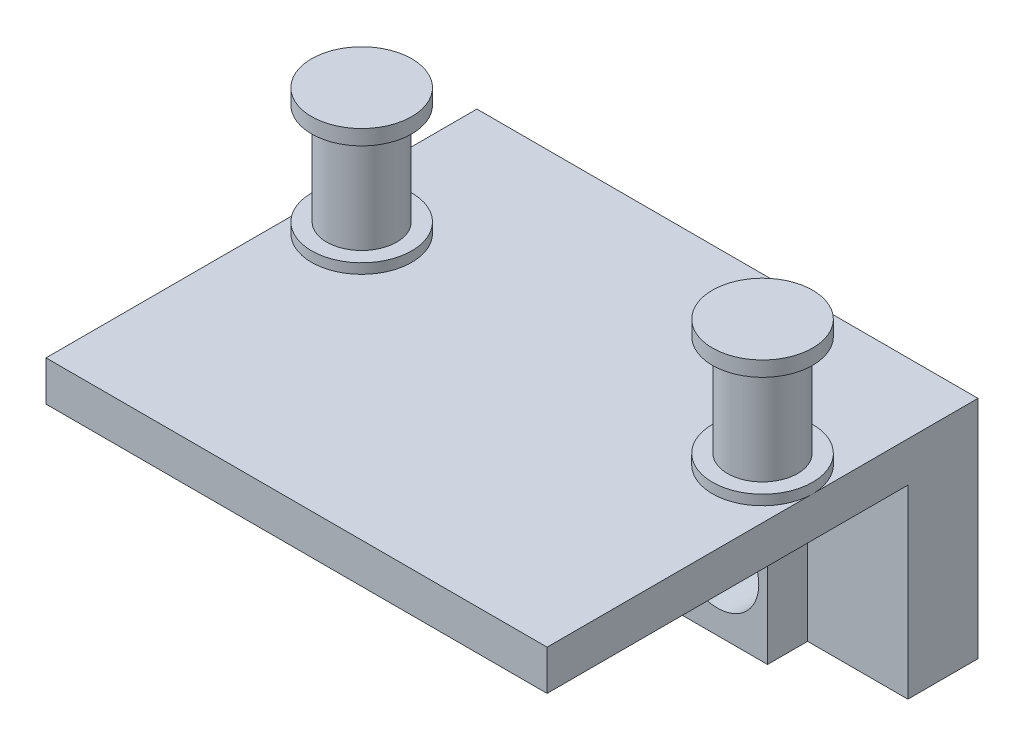
ISO-10303-21;
HEADER;
FILE_DESCRIPTION(('STEP AP214'),'2;1');
FILE_NAME('part.step','',(''),(''),'','','');
FILE_SCHEMA(('AUTOMOTIVE_DESIGN { 1 0 10303 214 1 1 1 1 }'));
ENDSEC;
DATA;
#1=APPLICATION_CONTEXT('core data for automotive mechanical design processes');
#2=APPLICATION_PROTOCOL_DEFINITION('international standard','automotive_design',2000,#1);
#3=PRODUCT_CONTEXT('',#1,'mechanical');
#4=PRODUCT('Part','Part','',(#3));
#5=PRODUCT_RELATED_PRODUCT_CATEGORY('part','',(#4));
#6=PRODUCT_DEFINITION_FORMATION('','',#4);
#7=PRODUCT_DEFINITION_CONTEXT('part definition',#1,'design');
#8=PRODUCT_DEFINITION('design','',#6,#7);
#9=PRODUCT_DEFINITION_SHAPE('','',#8);
#10=(LENGTH_UNIT() NAMED_UNIT(*) SI_UNIT(.MILLI.,.METRE.));
#11=(NAMED_UNIT(*) PLANE_ANGLE_UNIT() SI_UNIT($,.RADIAN.));
#12=(NAMED_UNIT(*) SI_UNIT($,.STERADIAN.) SOLID_ANGLE_UNIT());
#13=UNCERTAINTY_MEASURE_WITH_UNIT(LENGTH_MEASURE(1.E-05),#10,'distance_accuracy_value','');
#14=(GEOMETRIC_REPRESENTATION_CONTEXT(3) GLOBAL_UNCERTAINTY_ASSIGNED_CONTEXT((#13)) GLOBAL_UNIT_ASSIGNED_CONTEXT((#10,
#11,#12)) REPRESENTATION_CONTEXT('',''));
#15=CARTESIAN_POINT('',(0.,0.,0.));
#16=DIRECTION('',(0.,0.,1.));
#17=DIRECTION('',(1.,0.,0.));
#18=AXIS2_PLACEMENT_3D('',#15,#16,#17);
#19=CARTESIAN_POINT('',(0.,0.,0.));
#20=DIRECTION('',(1.,0.,0.));
#21=DIRECTION('',(0.,0.,-1.));
#22=AXIS2_PLACEMENT_3D('',#19,#20,#21);
#23=PLANE('',#22);
#24=DIRECTION('',(0.,1.,0.));
#25=VECTOR('',#24,1.);
#26=CARTESIAN_POINT('',(0.,-1.87499560809825,-20.6988598651624));
#27=LINE('',#26,#25);
#28=CARTESIAN_POINT('',(0.,-24.3749956080982,-20.6988598651624));
#29=VERTEX_POINT('',#28);
#30=CARTESIAN_POINT('',(0.,-5.87284560741039,-20.6988598651624));
#31=VERTEX_POINT('',#30);
#32=EDGE_CURVE('E408',#29,#31,#27,.T.);
#33=ORIENTED_EDGE('',*,*,#32,.F.);
#34=DIRECTION('',(0.,0.,-1.));
#35=VECTOR('',#34,1.);
#36=CARTESIAN_POINT('',(0.,-24.3749956080982,-16.6988598651624));
#37=LINE('',#36,#35);
#38=CARTESIAN_POINT('',(0.,-24.3749956080982,-16.6988598651624));
#39=VERTEX_POINT('',#38);
#40=EDGE_CURVE('E198',#39,#29,#37,.T.);
#41=ORIENTED_EDGE('',*,*,#40,.F.);
#42=DIRECTION('',(0.,-1.,0.));
#43=VECTOR('',#42,1.);
#44=CARTESIAN_POINT('',(0.,-13.3749956080982,-16.6988598651624));
#45=LINE('',#44,#43);
#46=CARTESIAN_POINT('',(0.,-13.3749956080982,-16.6988598651624));
#47=VERTEX_POINT('',#46);
#48=EDGE_CURVE('E108',#47,#39,#45,.T.);
#49=ORIENTED_EDGE('',*,*,#48,.F.);
#50=DIRECTION('',(0.,-0.707106781186549,0.707106781186546));
#51=VECTOR('',#50,1.);
#52=CARTESIAN_POINT('',(0.,-12.3749956080982,-17.6988598651624));
#53=LINE('',#52,#51);
#54=CARTESIAN_POINT('',(0.,-12.3749956080982,-17.6988598651624));
#55=VERTEX_POINT('',#54);
#56=EDGE_CURVE('E193',#55,#47,#53,.T.);
#57=ORIENTED_EDGE('',*,*,#56,.F.);
#58=DIRECTION('',(0.,-1.,0.));
#59=VECTOR('',#58,1.);
#60=CARTESIAN_POINT('',(0.,-6.87499560809824,-17.6988598651624));
#61=LINE('',#60,#59);
#62=CARTESIAN_POINT('',(0.,-6.87499560809824,-17.6988598651624));
#63=VERTEX_POINT('',#62);
#64=EDGE_CURVE('E151',#63,#55,#61,.T.);
#65=ORIENTED_EDGE('',*,*,#64,.F.);
#66=DIRECTION('',(0.,-0.554700196225229,-0.832050294337844));
#67=VECTOR('',#66,1.);
#68=CARTESIAN_POINT('',(0.,-5.87499560809824,-16.1988598651624));
#69=LINE('',#68,#67);
#70=CARTESIAN_POINT('',(0.,-5.87499560809824,-16.1988598651624));
#71=VERTEX_POINT('',#70);
#72=EDGE_CURVE('E188',#71,#63,#69,.T.);
#73=ORIENTED_EDGE('',*,*,#72,.F.);
#74=DIRECTION('',(0.,0.,-1.));
#75=VECTOR('',#74,1.);
#76=CARTESIAN_POINT('',(0.,-5.87499560809824,-7.19885986516238));
#77=LINE('',#76,#75);
#78=CARTESIAN_POINT('',(0.,-5.87499560809824,-7.19885986516238));
#79=VERTEX_POINT('',#78);
#80=EDGE_CURVE('E185',#79,#71,#77,.T.);
#81=ORIENTED_EDGE('',*,*,#80,.F.);
#82=DIRECTION('',(0.,0.624695047554425,-0.78086880944303));
#83=VECTOR('',#82,1.);
#84=CARTESIAN_POINT('',(0.,-6.67499560809824,-6.19885986516238));
#85=LINE('',#84,#83);
#86=CARTESIAN_POINT('',(0.,-6.67499560809824,-6.19885986516238));
#87=VERTEX_POINT('',#86);
#88=EDGE_CURVE('E182',#87,#79,#85,.T.);
#89=ORIENTED_EDGE('',*,*,#88,.F.);
#90=DIRECTION('',(0.,0.,-1.));
#91=VECTOR('',#90,1.);
#92=CARTESIAN_POINT('',(0.,-6.67499560809824,5.30114013483762));
#93=LINE('',#92,#91);
#94=CARTESIAN_POINT('',(0.,-6.67499560809824,5.30114013483762));
#95=VERTEX_POINT('',#94);
#96=EDGE_CURVE('E179',#95,#87,#93,.T.);
#97=ORIENTED_EDGE('',*,*,#96,.F.);
#98=DIRECTION('',(0.,-0.624695047554425,-0.78086880944303));
#99=VECTOR('',#98,1.);
#100=CARTESIAN_POINT('',(0.,-5.87499560809824,6.30114013483762));
#101=LINE('',#100,#99);
#102=CARTESIAN_POINT('',(0.,-5.87499560809824,6.30114013483762));
#103=VERTEX_POINT('',#102);
#104=EDGE_CURVE('E176',#103,#95,#101,.T.);
#105=ORIENTED_EDGE('',*,*,#104,.F.);
#106=DIRECTION('',(0.,0.,-1.));
#107=VECTOR('',#106,1.);
#108=CARTESIAN_POINT('',(0.,-5.87499560809824,15.3011401348376));
#109=LINE('',#108,#107);
#110=CARTESIAN_POINT('',(0.,-5.87499560809824,15.3011401348376));
#111=VERTEX_POINT('',#110);
#112=EDGE_CURVE('E172',#111,#103,#109,.T.);
#113=ORIENTED_EDGE('',*,*,#112,.F.);
#114=DIRECTION('',(0.,-1.,0.));
#115=VECTOR('',#114,1.);
#116=CARTESIAN_POINT('',(0.,-1.87499560809824,15.3011401348376));
#117=LINE('',#116,#115);
#118=CARTESIAN_POINT('',(0.,-5.87284560741039,15.3011401348376));
#119=VERTEX_POINT('',#118);
#120=EDGE_CURVE('E169',#119,#111,#117,.T.);
#121=ORIENTED_EDGE('',*,*,#120,.F.);
#122=DIRECTION('',(0.,0.,1.));
#123=VECTOR('',#122,1.);
#124=CARTESIAN_POINT('',(0.,-5.87284560741039,15.3011401348376));
#125=LINE('',#124,#123);
#126=EDGE_CURVE('E256',#31,#119,#125,.T.);
#127=ORIENTED_EDGE('',*,*,#126,.F.);
#128=EDGE_LOOP('',(#33,#41,#49,#57,#65,#73,#81,#89,#97,#105,#113,#121,#127));
#129=FACE_BOUND('',#128,.T.);
#130=ADVANCED_FACE('F45',(#129),#23,.F.);
#131=CARTESIAN_POINT('',(30.,0.,0.));
#132=DIRECTION('',(1.,0.,0.));
#133=DIRECTION('',(0.,0.,-1.));
#134=AXIS2_PLACEMENT_3D('',#131,#132,#133);
#135=PLANE('',#134);
#136=DIRECTION('',(0.,0.,-1.));
#137=VECTOR('',#136,1.);
#138=CARTESIAN_POINT('',(30.,-24.3749956080982,-16.6988598651624));
#139=LINE('',#138,#137);
#140=CARTESIAN_POINT('',(30.,-24.3749956080982,-16.6988598651624));
#141=VERTEX_POINT('',#140);
#142=CARTESIAN_POINT('',(30.,-24.3749956080982,-20.6988598651624));
#143=VERTEX_POINT('',#142);
#144=EDGE_CURVE('E162',#141,#143,#139,.T.);
#145=ORIENTED_EDGE('',*,*,#144,.T.);
#146=DIRECTION('',(0.,-1.,0.));
#147=VECTOR('',#146,1.);
#148=CARTESIAN_POINT('',(30.,-1.87499560809823,-20.6988598651624));
#149=LINE('',#148,#147);
#150=CARTESIAN_POINT('',(30.,-5.87499560809824,-20.6988598651624));
#151=VERTEX_POINT('',#150);
#152=EDGE_CURVE('E388',#151,#143,#149,.T.);
#153=ORIENTED_EDGE('',*,*,#152,.F.);
#154=DIRECTION('',(0.,0.,-1.));
#155=VECTOR('',#154,1.);
#156=CARTESIAN_POINT('',(30.,-5.87499560809824,15.3011401348376));
#157=LINE('',#156,#155);
#158=CARTESIAN_POINT('',(30.,-5.87499560809824,-16.1988598651624));
#159=VERTEX_POINT('',#158);
#160=EDGE_CURVE('E55',#159,#151,#157,.T.);
#161=ORIENTED_EDGE('',*,*,#160,.F.);
#162=DIRECTION('',(0.,-0.554700196225229,-0.832050294337844));
#163=VECTOR('',#162,1.);
#164=CARTESIAN_POINT('',(30.,-5.87499560809824,-16.1988598651624));
#165=LINE('',#164,#163);
#166=CARTESIAN_POINT('',(30.,-6.87499560809824,-17.6988598651624));
#167=VERTEX_POINT('',#166);
#168=EDGE_CURVE('E141',#159,#167,#165,.T.);
#169=ORIENTED_EDGE('',*,*,#168,.T.);
#170=DIRECTION('',(0.,-1.,0.));
#171=VECTOR('',#170,1.);
#172=CARTESIAN_POINT('',(30.,-6.87499560809824,-17.6988598651624));
#173=LINE('',#172,#171);
#174=CARTESIAN_POINT('',(30.,-12.3749956080982,-17.6988598651624));
#175=VERTEX_POINT('',#174);
#176=EDGE_CURVE('E134',#167,#175,#173,.T.);
#177=ORIENTED_EDGE('',*,*,#176,.T.);
#178=DIRECTION('',(0.,-0.707106781186549,0.707106781186546));
#179=VECTOR('',#178,1.);
#180=CARTESIAN_POINT('',(30.,-12.3749956080982,-17.6988598651624));
#181=LINE('',#180,#179);
#182=CARTESIAN_POINT('',(30.,-13.3749956080982,-16.6988598651624));
#183=VERTEX_POINT('',#182);
#184=EDGE_CURVE('E138',#175,#183,#181,.T.);
#185=ORIENTED_EDGE('',*,*,#184,.T.);
#186=DIRECTION('',(0.,-1.,0.));
#187=VECTOR('',#186,1.);
#188=CARTESIAN_POINT('',(30.,-13.3749956080982,-16.6988598651624));
#189=LINE('',#188,#187);
#190=EDGE_CURVE('E69',#183,#141,#189,.T.);
#191=ORIENTED_EDGE('',*,*,#190,.T.);
#192=EDGE_LOOP('',(#145,#153,#161,#169,#177,#185,#191));
#193=FACE_BOUND('',#192,.T.);
#194=ADVANCED_FACE('F136',(#193),#135,.T.);
#195=CARTESIAN_POINT('',(-5.00000000000002,10.7250043919018,-11.1988598651624));
#196=DIRECTION('',(0.,-1.,0.));
#197=DIRECTION('',(0.,0.,-1.));
#198=AXIS2_PLACEMENT_3D('',#195,#196,#197);
#199=CYLINDRICAL_SURFACE('',#198,5.);
#200=CARTESIAN_POINT('',(-5.00000000000002,-1.87499560809824,-11.1988598651624));
#201=DIRECTION('',(0.,-1.,0.));
#202=DIRECTION('',(0.,0.,-1.));
#203=AXIS2_PLACEMENT_3D('',#200,#201,#202);
#204=CIRCLE('',#203,5.);
#205=CARTESIAN_POINT('',(-10.,-1.87499560809824,-11.1988598651624));
#206=VERTEX_POINT('',#205);
#207=EDGE_CURVE('E61',#206,#206,#204,.T.);
#208=ORIENTED_EDGE('',*,*,#207,.F.);
#209=EDGE_LOOP('',(#208));
#210=FACE_BOUND('',#209,.T.);
#211=CARTESIAN_POINT('',(-5.00000000000002,-0.87499560809824,-11.1988598651624));
#212=DIRECTION('',(0.,1.,0.));
#213=DIRECTION('',(0.,0.,1.));
#214=AXIS2_PLACEMENT_3D('',#211,#212,#213);
#215=CIRCLE('',#214,4.99999999999998);
#216=CARTESIAN_POINT('',(-5.00000000000002,-0.87499560809824,-6.19885986516239));
#217=VERTEX_POINT('',#216);
#218=EDGE_CURVE('E344',#217,#217,#215,.T.);
#219=ORIENTED_EDGE('',*,*,#218,.F.);
#220=EDGE_LOOP('',(#219));
#221=FACE_BOUND('',#220,.T.);
#222=ADVANCED_FACE('F503',(#210,#221),#199,.T.);
#223=CARTESIAN_POINT('',(35.,10.7250043919018,-11.1988598651624));
#224=DIRECTION('',(0.,-1.,0.));
#225=DIRECTION('',(0.,0.,-1.));
#226=AXIS2_PLACEMENT_3D('',#223,#224,#225);
#227=CYLINDRICAL_SURFACE('',#226,5.);
#228=CARTESIAN_POINT('',(35.,-1.87499560809824,-11.1988598651624));
#229=DIRECTION('',(0.,1.,0.));
#230=DIRECTION('',(0.,0.,1.));
#231=AXIS2_PLACEMENT_3D('',#228,#229,#230);
#232=CIRCLE('',#231,5.);
#233=CARTESIAN_POINT('',(40.,-1.87499560809824,-11.1988598651624));
#234=VERTEX_POINT('',#233);
#235=EDGE_CURVE('E316',#234,#234,#232,.T.);
#236=ORIENTED_EDGE('',*,*,#235,.T.);
#237=EDGE_LOOP('',(#236));
#238=FACE_BOUND('',#237,.T.);
#239=CARTESIAN_POINT('',(35.,-0.87499560809824,-11.1988598651624));
#240=DIRECTION('',(0.,1.,0.));
#241=DIRECTION('',(0.,0.,1.));
#242=AXIS2_PLACEMENT_3D('',#239,#240,#241);
#243=CIRCLE('',#242,5.);
#244=CARTESIAN_POINT('',(35.,-0.87499560809824,-6.19885986516238));
#245=VERTEX_POINT('',#244);
#246=EDGE_CURVE('E360',#245,#245,#243,.T.);
#247=ORIENTED_EDGE('',*,*,#246,.F.);
#248=EDGE_LOOP('',(#247));
#249=FACE_BOUND('',#248,.T.);
#250=ADVANCED_FACE('F541',(#238,#249),#227,.T.);
#251=CARTESIAN_POINT('',(30.,-5.87499560809824,6.30114013483762));
#252=VERTEX_POINT('',#251);
#253=CARTESIAN_POINT('',(30.,-5.87499560809824,-7.19885986516238));
#254=VERTEX_POINT('',#253);
#255=EDGE_CURVE('E12',#252,#254,#157,.T.);
#256=ORIENTED_EDGE('',*,*,#255,.F.);
#257=DIRECTION('',(0.,-0.624695047554425,-0.78086880944303));
#258=VECTOR('',#257,1.);
#259=CARTESIAN_POINT('',(30.,-5.87499560809824,6.30114013483762));
#260=LINE('',#259,#258);
#261=CARTESIAN_POINT('',(30.,-6.67499560809824,5.30114013483762));
#262=VERTEX_POINT('',#261);
#263=EDGE_CURVE('E202',#252,#262,#260,.T.);
#264=ORIENTED_EDGE('',*,*,#263,.T.);
#265=DIRECTION('',(0.,0.,-1.));
#266=VECTOR('',#265,1.);
#267=CARTESIAN_POINT('',(30.,-6.67499560809824,5.30114013483762));
#268=LINE('',#267,#266);
#269=CARTESIAN_POINT('',(30.,-6.67499560809824,-6.19885986516238));
#270=VERTEX_POINT('',#269);
#271=EDGE_CURVE('E290',#262,#270,#268,.T.);
#272=ORIENTED_EDGE('',*,*,#271,.T.);
#273=DIRECTION('',(0.,0.624695047554425,-0.78086880944303));
#274=VECTOR('',#273,1.);
#275=CARTESIAN_POINT('',(30.,-6.67499560809824,-6.19885986516238));
#276=LINE('',#275,#274);
#277=EDGE_CURVE('E293',#270,#254,#276,.T.);
#278=ORIENTED_EDGE('',*,*,#277,.T.);
#279=EDGE_LOOP('',(#256,#264,#272,#278));
#280=FACE_BOUND('',#279,.T.);
#281=ADVANCED_FACE('F494',(#280),#135,.T.);
#282=CARTESIAN_POINT('',(30.,-1.87499560809824,-16.6988598651624));
#283=DIRECTION('',(0.,-1.,0.));
#284=DIRECTION('',(0.,0.,-1.));
#285=AXIS2_PLACEMENT_3D('',#282,#283,#284);
#286=PLANE('',#285);
#287=DIRECTION('',(0.,0.,1.));
#288=VECTOR('',#287,1.);
#289=CARTESIAN_POINT('',(40.,-1.87499560809824,15.3011401348376));
#290=LINE('',#289,#288);
#291=CARTESIAN_POINT('',(40.,-1.87499560809824,15.3011401348376));
#292=VERTEX_POINT('',#291);
#293=EDGE_CURVE('E301',#234,#292,#290,.T.);
#294=ORIENTED_EDGE('',*,*,#293,.F.);
#295=ORIENTED_EDGE('',*,*,#235,.F.);
#296=CARTESIAN_POINT('',(40.,-1.87499560809823,-27.6988598651624));
#297=VERTEX_POINT('',#296);
#298=EDGE_CURVE('E250',#297,#234,#290,.T.);
#299=ORIENTED_EDGE('',*,*,#298,.F.);
#300=DIRECTION('',(1.,0.,0.));
#301=VECTOR('',#300,1.);
#302=CARTESIAN_POINT('',(30.,-1.87499560809823,-27.6988598651624));
#303=LINE('',#302,#301);
#304=CARTESIAN_POINT('',(-10.,-1.87499560809825,-27.6988598651624));
#305=VERTEX_POINT('',#304);
#306=EDGE_CURVE('E324',#305,#297,#303,.T.);
#307=ORIENTED_EDGE('',*,*,#306,.F.);
#308=DIRECTION('',(0.,0.,-1.));
#309=VECTOR('',#308,1.);
#310=CARTESIAN_POINT('',(-10.,-1.87499560809824,15.3011401348376));
#311=LINE('',#310,#309);
#312=EDGE_CURVE('E261',#206,#305,#311,.T.);
#313=ORIENTED_EDGE('',*,*,#312,.F.);
#314=ORIENTED_EDGE('',*,*,#207,.T.);
#315=CARTESIAN_POINT('',(-10.,-1.87499560809824,15.3011401348376));
#316=VERTEX_POINT('',#315);
#317=EDGE_CURVE('E262',#316,#206,#311,.T.);
#318=ORIENTED_EDGE('',*,*,#317,.F.);
#319=DIRECTION('',(-1.,0.,0.));
#320=VECTOR('',#319,1.);
#321=CARTESIAN_POINT('',(30.,-1.87499560809824,15.3011401348376));
#322=LINE('',#321,#320);
#323=EDGE_CURVE('E49',#292,#316,#322,.T.);
#324=ORIENTED_EDGE('',*,*,#323,.F.);
#325=EDGE_LOOP('',(#294,#295,#299,#307,#313,#314,#318,#324));
#326=FACE_BOUND('',#325,.T.);
#327=ADVANCED_FACE('F47',(#326),#286,.F.);
#328=CARTESIAN_POINT('',(30.,-1.87499560809824,15.3011401348376));
#329=DIRECTION('',(0.,0.,-1.));
#330=DIRECTION('',(0.,1.,0.));
#331=AXIS2_PLACEMENT_3D('',#328,#329,#330);
#332=PLANE('',#331);
#333=ORIENTED_EDGE('',*,*,#323,.T.);
#334=DIRECTION('',(0.,1.,0.));
#335=VECTOR('',#334,1.);
#336=CARTESIAN_POINT('',(-10.,-1.87499560809824,15.3011401348376));
#337=LINE('',#336,#335);
#338=CARTESIAN_POINT('',(-10.,-5.87284560741039,15.3011401348376));
#339=VERTEX_POINT('',#338);
#340=EDGE_CURVE('E257',#339,#316,#337,.T.);
#341=ORIENTED_EDGE('',*,*,#340,.F.);
#342=DIRECTION('',(1.,0.,0.));
#343=VECTOR('',#342,1.);
#344=CARTESIAN_POINT('',(-10.,-5.87284560741039,15.3011401348376));
#345=LINE('',#344,#343);
#346=EDGE_CURVE('E270',#339,#119,#345,.T.);
#347=ORIENTED_EDGE('',*,*,#346,.T.);
#348=ORIENTED_EDGE('',*,*,#120,.T.);
#349=DIRECTION('',(-1.,0.,0.));
#350=VECTOR('',#349,1.);
#351=CARTESIAN_POINT('',(30.,-5.87499560809824,15.3011401348376));
#352=LINE('',#351,#350);
#353=CARTESIAN_POINT('',(40.,-5.87499560809824,15.3011401348376));
#354=VERTEX_POINT('',#353);
#355=EDGE_CURVE('E228',#354,#111,#352,.T.);
#356=ORIENTED_EDGE('',*,*,#355,.F.);
#357=DIRECTION('',(0.,-1.,0.));
#358=VECTOR('',#357,1.);
#359=CARTESIAN_POINT('',(40.,-5.87499560809824,15.3011401348376));
#360=LINE('',#359,#358);
#361=EDGE_CURVE('E307',#292,#354,#360,.T.);
#362=ORIENTED_EDGE('',*,*,#361,.F.);
#363=EDGE_LOOP('',(#333,#341,#347,#348,#356,#362));
#364=FACE_BOUND('',#363,.T.);
#365=ADVANCED_FACE('F483',(#364),#332,.F.);
#366=CARTESIAN_POINT('',(30.,-5.87499560809824,6.30114013483762));
#367=DIRECTION('',(0.,0.78086880944303,-0.624695047554424));
#368=DIRECTION('',(0.,0.624695047554424,0.78086880944303));
#369=AXIS2_PLACEMENT_3D('',#366,#367,#368);
#370=PLANE('',#369);
#371=ORIENTED_EDGE('',*,*,#104,.T.);
#372=DIRECTION('',(-1.,0.,0.));
#373=VECTOR('',#372,1.);
#374=CARTESIAN_POINT('',(30.,-6.67499560809824,5.30114013483762));
#375=LINE('',#374,#373);
#376=EDGE_CURVE('E221',#262,#95,#375,.T.);
#377=ORIENTED_EDGE('',*,*,#376,.F.);
#378=ORIENTED_EDGE('',*,*,#263,.F.);
#379=DIRECTION('',(-1.,0.,0.));
#380=VECTOR('',#379,1.);
#381=CARTESIAN_POINT('',(30.,-5.87499560809824,6.30114013483762));
#382=LINE('',#381,#380);
#383=EDGE_CURVE('E225',#252,#103,#382,.T.);
#384=ORIENTED_EDGE('',*,*,#383,.T.);
#385=EDGE_LOOP('',(#371,#377,#378,#384));
#386=FACE_BOUND('',#385,.T.);
#387=ADVANCED_FACE('F485',(#386),#370,.F.);
#388=CARTESIAN_POINT('',(30.,-6.67499560809824,5.30114013483762));
#389=DIRECTION('',(0.,1.,0.));
#390=DIRECTION('',(0.,0.,1.));
#391=AXIS2_PLACEMENT_3D('',#388,#389,#390);
#392=PLANE('',#391);
#393=ORIENTED_EDGE('',*,*,#96,.T.);
#394=DIRECTION('',(-1.,0.,0.));
#395=VECTOR('',#394,1.);
#396=CARTESIAN_POINT('',(30.,-6.67499560809824,-6.19885986516238));
#397=LINE('',#396,#395);
#398=EDGE_CURVE('E217',#270,#87,#397,.T.);
#399=ORIENTED_EDGE('',*,*,#398,.F.);
#400=ORIENTED_EDGE('',*,*,#271,.F.);
#401=ORIENTED_EDGE('',*,*,#376,.T.);
#402=EDGE_LOOP('',(#393,#399,#400,#401));
#403=FACE_BOUND('',#402,.T.);
#404=ADVANCED_FACE('F490',(#403),#392,.F.);
#405=CARTESIAN_POINT('',(30.,-6.67499560809824,-6.19885986516238));
#406=DIRECTION('',(0.,0.78086880944303,0.624695047554424));
#407=DIRECTION('',(0.,-0.624695047554424,0.78086880944303));
#408=AXIS2_PLACEMENT_3D('',#405,#406,#407);
#409=PLANE('',#408);
#410=ORIENTED_EDGE('',*,*,#88,.T.);
#411=DIRECTION('',(-1.,0.,0.));
#412=VECTOR('',#411,1.);
#413=CARTESIAN_POINT('',(30.,-5.87499560809824,-7.19885986516238));
#414=LINE('',#413,#412);
#415=EDGE_CURVE('E213',#254,#79,#414,.T.);
#416=ORIENTED_EDGE('',*,*,#415,.F.);
#417=ORIENTED_EDGE('',*,*,#277,.F.);
#418=ORIENTED_EDGE('',*,*,#398,.T.);
#419=EDGE_LOOP('',(#410,#416,#417,#418));
#420=FACE_BOUND('',#419,.T.);
#421=ADVANCED_FACE('F523',(#420),#409,.F.);
#422=CARTESIAN_POINT('',(30.,-5.87499560809824,-7.19885986516238));
#423=DIRECTION('',(0.,1.,0.));
#424=DIRECTION('',(0.,0.,1.));
#425=AXIS2_PLACEMENT_3D('',#422,#423,#424);
#426=PLANE('',#425);
#427=ORIENTED_EDGE('',*,*,#80,.T.);
#428=DIRECTION('',(-1.,0.,0.));
#429=VECTOR('',#428,1.);
#430=CARTESIAN_POINT('',(30.,-5.87499560809824,-16.1988598651624));
#431=LINE('',#430,#429);
#432=EDGE_CURVE('E209',#159,#71,#431,.T.);
#433=ORIENTED_EDGE('',*,*,#432,.F.);
#434=ORIENTED_EDGE('',*,*,#160,.T.);
#435=DIRECTION('',(-1.,0.,0.));
#436=VECTOR('',#435,1.);
#437=CARTESIAN_POINT('',(40.,-5.87499560809824,-20.6988598651624));
#438=LINE('',#437,#436);
#439=CARTESIAN_POINT('',(40.,-5.87499560809824,-20.6988598651624));
#440=VERTEX_POINT('',#439);
#441=EDGE_CURVE('E252',#440,#151,#438,.T.);
#442=ORIENTED_EDGE('',*,*,#441,.F.);
#443=DIRECTION('',(0.,0.,-1.));
#444=VECTOR('',#443,1.);
#445=CARTESIAN_POINT('',(40.,-5.87499560809824,15.3011401348376));
#446=LINE('',#445,#444);
#447=EDGE_CURVE('E304',#354,#440,#446,.T.);
#448=ORIENTED_EDGE('',*,*,#447,.F.);
#449=ORIENTED_EDGE('',*,*,#355,.T.);
#450=ORIENTED_EDGE('',*,*,#112,.T.);
#451=ORIENTED_EDGE('',*,*,#383,.F.);
#452=ORIENTED_EDGE('',*,*,#255,.T.);
#453=ORIENTED_EDGE('',*,*,#415,.T.);
#454=EDGE_LOOP('',(#427,#433,#434,#442,#448,#449,#450,#451,#452,#453));
#455=FACE_BOUND('',#454,.T.);
#456=ADVANCED_FACE('F479',(#455),#426,.F.);
#457=CARTESIAN_POINT('',(30.,-5.87499560809824,-16.1988598651624));
#458=DIRECTION('',(0.,0.832050294337844,-0.554700196225229));
#459=DIRECTION('',(0.,0.554700196225229,0.832050294337844));
#460=AXIS2_PLACEMENT_3D('',#457,#458,#459);
#461=PLANE('',#460);
#462=ORIENTED_EDGE('',*,*,#72,.T.);
#463=DIRECTION('',(-1.,0.,0.));
#464=VECTOR('',#463,1.);
#465=CARTESIAN_POINT('',(30.,-6.87499560809824,-17.6988598651624));
#466=LINE('',#465,#464);
#467=EDGE_CURVE('E155',#167,#63,#466,.T.);
#468=ORIENTED_EDGE('',*,*,#467,.F.);
#469=ORIENTED_EDGE('',*,*,#168,.F.);
#470=ORIENTED_EDGE('',*,*,#432,.T.);
#471=EDGE_LOOP('',(#462,#468,#469,#470));
#472=FACE_BOUND('',#471,.T.);
#473=ADVANCED_FACE('F517',(#472),#461,.F.);
#474=CARTESIAN_POINT('',(30.,-6.87499560809824,-17.6988598651624));
#475=DIRECTION('',(0.,0.,-1.));
#476=DIRECTION('',(-1.,0.,0.));
#477=AXIS2_PLACEMENT_3D('',#474,#475,#476);
#478=PLANE('',#477);
#479=ORIENTED_EDGE('',*,*,#64,.T.);
#480=DIRECTION('',(-1.,0.,0.));
#481=VECTOR('',#480,1.);
#482=CARTESIAN_POINT('',(30.,-12.3749956080982,-17.6988598651624));
#483=LINE('',#482,#481);
#484=EDGE_CURVE('E148',#175,#55,#483,.T.);
#485=ORIENTED_EDGE('',*,*,#484,.F.);
#486=ORIENTED_EDGE('',*,*,#176,.F.);
#487=ORIENTED_EDGE('',*,*,#467,.T.);
#488=EDGE_LOOP('',(#479,#485,#486,#487));
#489=FACE_BOUND('',#488,.T.);
#490=ADVANCED_FACE('F149',(#489),#478,.F.);
#491=CARTESIAN_POINT('',(30.,-12.3749956080982,-17.6988598651624));
#492=DIRECTION('',(0.,-0.707106781186546,-0.707106781186549));
#493=DIRECTION('',(0.,0.707106781186549,-0.707106781186546));
#494=AXIS2_PLACEMENT_3D('',#491,#492,#493);
#495=PLANE('',#494);
#496=ORIENTED_EDGE('',*,*,#56,.T.);
#497=DIRECTION('',(-1.,0.,0.));
#498=VECTOR('',#497,1.);
#499=CARTESIAN_POINT('',(30.,-13.3749956080982,-16.6988598651624));
#500=LINE('',#499,#498);
#501=EDGE_CURVE('E156',#183,#47,#500,.T.);
#502=ORIENTED_EDGE('',*,*,#501,.F.);
#503=ORIENTED_EDGE('',*,*,#184,.F.);
#504=ORIENTED_EDGE('',*,*,#484,.T.);
#505=EDGE_LOOP('',(#496,#502,#503,#504));
#506=FACE_BOUND('',#505,.T.);
#507=ADVANCED_FACE('F158',(#506),#495,.F.);
#508=CARTESIAN_POINT('',(30.,-13.3749956080982,-16.6988598651624));
#509=DIRECTION('',(0.,0.,-1.));
#510=DIRECTION('',(0.,1.,0.));
#511=AXIS2_PLACEMENT_3D('',#508,#509,#510);
#512=PLANE('',#511);
#513=CARTESIAN_POINT('',(25.,-17.8749956080982,-16.6988598651624));
#514=DIRECTION('',(0.,0.,-1.));
#515=DIRECTION('',(0.,1.,0.));
#516=AXIS2_PLACEMENT_3D('',#513,#514,#515);
#517=CIRCLE('',#516,4.125);
#518=CARTESIAN_POINT('',(25.,-13.7499956080982,-16.6988598651624));
#519=VERTEX_POINT('',#518);
#520=EDGE_CURVE('E173',#519,#519,#517,.T.);
#521=ORIENTED_EDGE('',*,*,#520,.T.);
#522=EDGE_LOOP('',(#521));
#523=FACE_BOUND('',#522,.T.);
#524=CARTESIAN_POINT('',(5.,-17.8749956080982,-16.6988598651624));
#525=DIRECTION('',(0.,0.,-1.));
#526=DIRECTION('',(0.,1.,0.));
#527=AXIS2_PLACEMENT_3D('',#524,#525,#526);
#528=CIRCLE('',#527,4.125);
#529=CARTESIAN_POINT('',(5.,-13.7499956080982,-16.6988598651624));
#530=VERTEX_POINT('',#529);
#531=EDGE_CURVE('E281',#530,#530,#528,.T.);
#532=ORIENTED_EDGE('',*,*,#531,.T.);
#533=EDGE_LOOP('',(#532));
#534=FACE_BOUND('',#533,.T.);
#535=ORIENTED_EDGE('',*,*,#48,.T.);
#536=DIRECTION('',(-1.,0.,0.));
#537=VECTOR('',#536,1.);
#538=CARTESIAN_POINT('',(30.,-24.3749956080982,-16.6988598651624));
#539=LINE('',#538,#537);
#540=EDGE_CURVE('E168',#141,#39,#539,.T.);
#541=ORIENTED_EDGE('',*,*,#540,.F.);
#542=ORIENTED_EDGE('',*,*,#190,.F.);
#543=ORIENTED_EDGE('',*,*,#501,.T.);
#544=EDGE_LOOP('',(#535,#541,#542,#543));
#545=FACE_BOUND('',#544,.T.);
#546=ADVANCED_FACE('F474',(#523,#534,#545),#512,.F.);
#547=CARTESIAN_POINT('',(30.,-24.3749956080982,-16.6988598651624));
#548=DIRECTION('',(0.,1.,0.));
#549=DIRECTION('',(0.,0.,1.));
#550=AXIS2_PLACEMENT_3D('',#547,#548,#549);
#551=PLANE('',#550);
#552=ORIENTED_EDGE('',*,*,#40,.T.);
#553=DIRECTION('',(1.,0.,0.));
#554=VECTOR('',#553,1.);
#555=CARTESIAN_POINT('',(-33.5637433358964,-24.3749956080982,-20.6988598651624));
#556=LINE('',#555,#554);
#557=CARTESIAN_POINT('',(-10.,-24.3749956080982,-20.6988598651624));
#558=VERTEX_POINT('',#557);
#559=EDGE_CURVE('E404',#558,#29,#556,.T.);
#560=ORIENTED_EDGE('',*,*,#559,.F.);
#561=DIRECTION('',(0.,0.,-1.));
#562=VECTOR('',#561,1.);
#563=CARTESIAN_POINT('',(-10.,-24.3749956080982,-20.6988598651624));
#564=LINE('',#563,#562);
#565=CARTESIAN_POINT('',(-10.,-24.3749956080982,-27.6988598651624));
#566=VERTEX_POINT('',#565);
#567=EDGE_CURVE('E400',#558,#566,#564,.T.);
#568=ORIENTED_EDGE('',*,*,#567,.T.);
#569=DIRECTION('',(-1.,0.,0.));
#570=VECTOR('',#569,1.);
#571=CARTESIAN_POINT('',(30.,-24.3749956080982,-27.6988598651624));
#572=LINE('',#571,#570);
#573=CARTESIAN_POINT('',(40.,-24.3749956080982,-27.6988598651624));
#574=VERTEX_POINT('',#573);
#575=EDGE_CURVE('E328',#574,#566,#572,.T.);
#576=ORIENTED_EDGE('',*,*,#575,.F.);
#577=DIRECTION('',(0.,0.,1.));
#578=VECTOR('',#577,1.);
#579=CARTESIAN_POINT('',(40.,-24.3749956080982,-27.6988598651624));
#580=LINE('',#579,#578);
#581=CARTESIAN_POINT('',(40.,-24.3749956080982,-20.6988598651624));
#582=VERTEX_POINT('',#581);
#583=EDGE_CURVE('E380',#574,#582,#580,.T.);
#584=ORIENTED_EDGE('',*,*,#583,.T.);
#585=DIRECTION('',(-1.,0.,0.));
#586=VECTOR('',#585,1.);
#587=CARTESIAN_POINT('',(63.5637433358964,-24.3749956080982,-20.6988598651624));
#588=LINE('',#587,#586);
#589=EDGE_CURVE('E384',#582,#143,#588,.T.);
#590=ORIENTED_EDGE('',*,*,#589,.T.);
#591=ORIENTED_EDGE('',*,*,#144,.F.);
#592=ORIENTED_EDGE('',*,*,#540,.T.);
#593=EDGE_LOOP('',(#552,#560,#568,#576,#584,#590,#591,#592));
#594=FACE_BOUND('',#593,.T.);
#595=ADVANCED_FACE('F471',(#594),#551,.F.);
#596=CARTESIAN_POINT('',(5.,-17.8749956080982,15.3011401348376));
#597=DIRECTION('',(0.,0.,-1.));
#598=DIRECTION('',(-1.,0.,0.));
#599=AXIS2_PLACEMENT_3D('',#596,#597,#598);
#600=CYLINDRICAL_SURFACE('',#599,4.125);
#601=ORIENTED_EDGE('',*,*,#531,.F.);
#602=EDGE_LOOP('',(#601));
#603=FACE_BOUND('',#602,.T.);
#604=CARTESIAN_POINT('',(5.,-17.8749956080982,-27.6988598651624));
#605=DIRECTION('',(0.,0.,-1.));
#606=DIRECTION('',(0.,1.,0.));
#607=AXIS2_PLACEMENT_3D('',#604,#605,#606);
#608=CIRCLE('',#607,4.125);
#609=CARTESIAN_POINT('',(5.,-13.7499956080982,-27.6988598651624));
#610=VERTEX_POINT('',#609);
#611=EDGE_CURVE('E336',#610,#610,#608,.T.);
#612=ORIENTED_EDGE('',*,*,#611,.T.);
#613=EDGE_LOOP('',(#612));
#614=FACE_BOUND('',#613,.T.);
#615=ADVANCED_FACE('F509',(#603,#614),#600,.F.);
#616=CARTESIAN_POINT('',(25.,-17.8749956080982,15.3011401348376));
#617=DIRECTION('',(0.,0.,-1.));
#618=DIRECTION('',(-1.,0.,0.));
#619=AXIS2_PLACEMENT_3D('',#616,#617,#618);
#620=CYLINDRICAL_SURFACE('',#619,4.125);
#621=ORIENTED_EDGE('',*,*,#520,.F.);
#622=EDGE_LOOP('',(#621));
#623=FACE_BOUND('',#622,.T.);
#624=CARTESIAN_POINT('',(25.,-17.8749956080982,-27.6988598651624));
#625=DIRECTION('',(0.,0.,-1.));
#626=DIRECTION('',(0.,1.,0.));
#627=AXIS2_PLACEMENT_3D('',#624,#625,#626);
#628=CIRCLE('',#627,4.125);
#629=CARTESIAN_POINT('',(25.,-13.7499956080982,-27.6988598651624));
#630=VERTEX_POINT('',#629);
#631=EDGE_CURVE('E332',#630,#630,#628,.T.);
#632=ORIENTED_EDGE('',*,*,#631,.T.);
#633=EDGE_LOOP('',(#632));
#634=FACE_BOUND('',#633,.T.);
#635=ADVANCED_FACE('F605',(#623,#634),#620,.F.);
#636=CARTESIAN_POINT('',(-10.,-5.87284560741039,15.3011401348376));
#637=DIRECTION('',(0.,1.,0.));
#638=DIRECTION('',(0.,0.,1.));
#639=AXIS2_PLACEMENT_3D('',#636,#637,#638);
#640=PLANE('',#639);
#641=ORIENTED_EDGE('',*,*,#126,.T.);
#642=ORIENTED_EDGE('',*,*,#346,.F.);
#643=DIRECTION('',(0.,0.,1.));
#644=VECTOR('',#643,1.);
#645=CARTESIAN_POINT('',(-10.,-5.87284560741039,15.3011401348376));
#646=LINE('',#645,#644);
#647=CARTESIAN_POINT('',(-10.,-5.87284560741039,-20.6988598651624));
#648=VERTEX_POINT('',#647);
#649=EDGE_CURVE('E266',#648,#339,#646,.T.);
#650=ORIENTED_EDGE('',*,*,#649,.F.);
#651=DIRECTION('',(1.,0.,0.));
#652=VECTOR('',#651,1.);
#653=CARTESIAN_POINT('',(-10.,-5.87284560741039,-20.6988598651624));
#654=LINE('',#653,#652);
#655=EDGE_CURVE('E277',#648,#31,#654,.T.);
#656=ORIENTED_EDGE('',*,*,#655,.T.);
#657=EDGE_LOOP('',(#641,#642,#650,#656));
#658=FACE_BOUND('',#657,.T.);
#659=ADVANCED_FACE('F430',(#658),#640,.F.);
#660=CARTESIAN_POINT('',(-10.,0.,0.));
#661=DIRECTION('',(1.,0.,0.));
#662=DIRECTION('',(0.,0.,-1.));
#663=AXIS2_PLACEMENT_3D('',#660,#661,#662);
#664=PLANE('',#663);
#665=ORIENTED_EDGE('',*,*,#340,.T.);
#666=ORIENTED_EDGE('',*,*,#317,.T.);
#667=ORIENTED_EDGE('',*,*,#312,.T.);
#668=DIRECTION('',(0.,1.,0.));
#669=VECTOR('',#668,1.);
#670=CARTESIAN_POINT('',(-10.,-1.87499560809825,-27.6988598651624));
#671=LINE('',#670,#669);
#672=EDGE_CURVE('E396',#566,#305,#671,.T.);
#673=ORIENTED_EDGE('',*,*,#672,.F.);
#674=ORIENTED_EDGE('',*,*,#567,.F.);
#675=DIRECTION('',(0.,-1.,0.));
#676=VECTOR('',#675,1.);
#677=CARTESIAN_POINT('',(-10.,-1.87499560809825,-20.6988598651624));
#678=LINE('',#677,#676);
#679=EDGE_CURVE('E392',#648,#558,#678,.T.);
#680=ORIENTED_EDGE('',*,*,#679,.F.);
#681=ORIENTED_EDGE('',*,*,#649,.T.);
#682=EDGE_LOOP('',(#665,#666,#667,#673,#674,#680,#681));
#683=FACE_BOUND('',#682,.T.);
#684=ADVANCED_FACE('F434',(#683),#664,.F.);
#685=CARTESIAN_POINT('',(40.,0.,0.));
#686=DIRECTION('',(-1.,0.,0.));
#687=DIRECTION('',(0.,0.,1.));
#688=AXIS2_PLACEMENT_3D('',#685,#686,#687);
#689=PLANE('',#688);
#690=ORIENTED_EDGE('',*,*,#361,.T.);
#691=ORIENTED_EDGE('',*,*,#447,.T.);
#692=DIRECTION('',(0.,1.,0.));
#693=VECTOR('',#692,1.);
#694=CARTESIAN_POINT('',(40.,-1.87499560809823,-20.6988598651624));
#695=LINE('',#694,#693);
#696=EDGE_CURVE('E376',#582,#440,#695,.T.);
#697=ORIENTED_EDGE('',*,*,#696,.F.);
#698=ORIENTED_EDGE('',*,*,#583,.F.);
#699=DIRECTION('',(0.,-1.,0.));
#700=VECTOR('',#699,1.);
#701=CARTESIAN_POINT('',(40.,-1.87499560809823,-27.6988598651624));
#702=LINE('',#701,#700);
#703=EDGE_CURVE('E372',#297,#574,#702,.T.);
#704=ORIENTED_EDGE('',*,*,#703,.F.);
#705=ORIENTED_EDGE('',*,*,#298,.T.);
#706=ORIENTED_EDGE('',*,*,#293,.T.);
#707=EDGE_LOOP('',(#690,#691,#697,#698,#704,#705,#706));
#708=FACE_BOUND('',#707,.T.);
#709=ADVANCED_FACE('F481',(#708),#689,.F.);
#710=CARTESIAN_POINT('',(0.,0.,-27.6988598651624));
#711=DIRECTION('',(0.,0.,1.));
#712=DIRECTION('',(0.,-1.,0.));
#713=AXIS2_PLACEMENT_3D('',#710,#711,#712);
#714=PLANE('',#713);
#715=ORIENTED_EDGE('',*,*,#306,.T.);
#716=ORIENTED_EDGE('',*,*,#703,.T.);
#717=ORIENTED_EDGE('',*,*,#575,.T.);
#718=ORIENTED_EDGE('',*,*,#672,.T.);
#719=EDGE_LOOP('',(#715,#716,#717,#718));
#720=FACE_BOUND('',#719,.T.);
#721=ORIENTED_EDGE('',*,*,#631,.F.);
#722=EDGE_LOOP('',(#721));
#723=FACE_BOUND('',#722,.T.);
#724=ORIENTED_EDGE('',*,*,#611,.F.);
#725=EDGE_LOOP('',(#724));
#726=FACE_BOUND('',#725,.T.);
#727=ADVANCED_FACE('F464',(#720,#723,#726),#714,.F.);
#728=CARTESIAN_POINT('',(35.,-0.87499560809824,-11.1988598651624));
#729=DIRECTION('',(0.,1.,0.));
#730=DIRECTION('',(0.,0.,1.));
#731=AXIS2_PLACEMENT_3D('',#728,#729,#730);
#732=PLANE('',#731);
#733=ORIENTED_EDGE('',*,*,#246,.T.);
#734=EDGE_LOOP('',(#733));
#735=FACE_BOUND('',#734,.T.);
#736=CARTESIAN_POINT('',(35.,-0.87499560809824,-11.1988598651624));
#737=DIRECTION('',(0.,1.,0.));
#738=DIRECTION('',(0.,0.,1.));
#739=AXIS2_PLACEMENT_3D('',#736,#737,#738);
#740=CIRCLE('',#739,3.5);
#741=CARTESIAN_POINT('',(35.,-0.874995608098238,-14.6988598651624));
#742=VERTEX_POINT('',#741);
#743=EDGE_CURVE('E364',#742,#742,#740,.T.);
#744=ORIENTED_EDGE('',*,*,#743,.F.);
#745=EDGE_LOOP('',(#744));
#746=FACE_BOUND('',#745,.T.);
#747=ADVANCED_FACE('F585',(#735,#746),#732,.T.);
#748=CARTESIAN_POINT('',(35.,24.8671400156327,-11.1988598651624));
#749=DIRECTION('',(0.,-1.,0.));
#750=DIRECTION('',(0.,0.,-1.));
#751=AXIS2_PLACEMENT_3D('',#748,#749,#750);
#752=CYLINDRICAL_SURFACE('',#751,3.5);
#753=CARTESIAN_POINT('',(35.,9.22500439190176,-11.1988598651624));
#754=DIRECTION('',(0.,1.,0.));
#755=DIRECTION('',(0.,0.,1.));
#756=AXIS2_PLACEMENT_3D('',#753,#754,#755);
#757=CIRCLE('',#756,3.5);
#758=CARTESIAN_POINT('',(35.,9.22500439190177,-14.6988598651624));
#759=VERTEX_POINT('',#758);
#760=EDGE_CURVE('E368',#759,#759,#757,.T.);
#761=CARTESIAN_POINT('',(35.,-0.874995608098238,-14.6988598651624));
#762=CARTESIAN_POINT('',(35.,-0.769787274764905,-14.6988598651624));
#763=CARTESIAN_POINT('',(35.,-0.664578941431572,-14.6988598651624));
#764=CARTESIAN_POINT('',(35.,-0.454162274764905,-14.6988598651624));
#765=CARTESIAN_POINT('',(35.,-0.348953941431572,-14.6988598651624));
#766=CARTESIAN_POINT('',(35.,-0.138537274764905,-14.6988598651624));
#767=CARTESIAN_POINT('',(35.,-0.0333289414315719,-14.6988598651624));
#768=CARTESIAN_POINT('',(35.,0.177087725235095,-14.6988598651624));
#769=CARTESIAN_POINT('',(35.,0.282296058568428,-14.6988598651624));
#770=CARTESIAN_POINT('',(35.,0.492712725235095,-14.6988598651624));
#771=CARTESIAN_POINT('',(35.,0.597921058568428,-14.6988598651624));
#772=CARTESIAN_POINT('',(35.,0.808337725235095,-14.6988598651624));
#773=CARTESIAN_POINT('',(35.,0.913546058568428,-14.6988598651624));
#774=CARTESIAN_POINT('',(35.,1.12396272523509,-14.6988598651624));
#775=CARTESIAN_POINT('',(35.,1.22917105856843,-14.6988598651624));
#776=CARTESIAN_POINT('',(35.,1.43958772523509,-14.6988598651624));
#777=CARTESIAN_POINT('',(35.,1.54479605856843,-14.6988598651624));
#778=CARTESIAN_POINT('',(35.,1.75521272523509,-14.6988598651624));
#779=CARTESIAN_POINT('',(35.,1.86042105856843,-14.6988598651624));
#780=CARTESIAN_POINT('',(35.,2.0708377252351,-14.6988598651624));
#781=CARTESIAN_POINT('',(35.,2.17604605856843,-14.6988598651624));
#782=CARTESIAN_POINT('',(35.,2.3864627252351,-14.6988598651624));
#783=CARTESIAN_POINT('',(35.,2.49167105856843,-14.6988598651624));
#784=CARTESIAN_POINT('',(35.,2.7020877252351,-14.6988598651624));
#785=CARTESIAN_POINT('',(35.,2.80729605856843,-14.6988598651624));
#786=CARTESIAN_POINT('',(35.,3.0177127252351,-14.6988598651624));
#787=CARTESIAN_POINT('',(35.,3.12292105856843,-14.6988598651624));
#788=CARTESIAN_POINT('',(35.,3.3333377252351,-14.6988598651624));
#789=CARTESIAN_POINT('',(35.,3.43854605856843,-14.6988598651624));
#790=CARTESIAN_POINT('',(35.,3.6489627252351,-14.6988598651624));
#791=CARTESIAN_POINT('',(35.,3.75417105856843,-14.6988598651624));
#792=CARTESIAN_POINT('',(35.,3.9645877252351,-14.6988598651624));
#793=CARTESIAN_POINT('',(35.,4.06979605856843,-14.6988598651624));
#794=CARTESIAN_POINT('',(35.,4.2802127252351,-14.6988598651624));
#795=CARTESIAN_POINT('',(35.,4.38542105856843,-14.6988598651624));
#796=CARTESIAN_POINT('',(35.,4.5958377252351,-14.6988598651624));
#797=CARTESIAN_POINT('',(35.,4.70104605856843,-14.6988598651624));
#798=CARTESIAN_POINT('',(35.,4.9114627252351,-14.6988598651624));
#799=CARTESIAN_POINT('',(35.,5.01667105856843,-14.6988598651624));
#800=CARTESIAN_POINT('',(35.,5.2270877252351,-14.6988598651624));
#801=CARTESIAN_POINT('',(35.,5.33229605856843,-14.6988598651624));
#802=CARTESIAN_POINT('',(35.,5.5427127252351,-14.6988598651624));
#803=CARTESIAN_POINT('',(35.,5.64792105856843,-14.6988598651624));
#804=CARTESIAN_POINT('',(35.,5.8583377252351,-14.6988598651624));
#805=CARTESIAN_POINT('',(35.,5.96354605856843,-14.6988598651624));
#806=CARTESIAN_POINT('',(35.,6.1739627252351,-14.6988598651624));
#807=CARTESIAN_POINT('',(35.,6.27917105856843,-14.6988598651624));
#808=CARTESIAN_POINT('',(35.,6.4895877252351,-14.6988598651624));
#809=CARTESIAN_POINT('',(35.,6.59479605856843,-14.6988598651624));
#810=CARTESIAN_POINT('',(35.,6.8052127252351,-14.6988598651624));
#811=CARTESIAN_POINT('',(35.,6.91042105856843,-14.6988598651624));
#812=CARTESIAN_POINT('',(35.,7.1208377252351,-14.6988598651624));
#813=CARTESIAN_POINT('',(35.,7.22604605856843,-14.6988598651624));
#814=CARTESIAN_POINT('',(35.,7.4364627252351,-14.6988598651624));
#815=CARTESIAN_POINT('',(35.,7.54167105856843,-14.6988598651624));
#816=CARTESIAN_POINT('',(35.,7.7520877252351,-14.6988598651624));
#817=CARTESIAN_POINT('',(35.,7.85729605856843,-14.6988598651624));
#818=CARTESIAN_POINT('',(35.,8.0677127252351,-14.6988598651624));
#819=CARTESIAN_POINT('',(35.,8.17292105856843,-14.6988598651624));
#820=CARTESIAN_POINT('',(35.,8.3833377252351,-14.6988598651624));
#821=CARTESIAN_POINT('',(35.,8.48854605856843,-14.6988598651624));
#822=CARTESIAN_POINT('',(35.,8.6989627252351,-14.6988598651624));
#823=CARTESIAN_POINT('',(35.,8.80417105856843,-14.6988598651624));
#824=CARTESIAN_POINT('',(35.,9.0145877252351,-14.6988598651624));
#825=CARTESIAN_POINT('',(35.,9.11979605856843,-14.6988598651624));
#826=CARTESIAN_POINT('',(35.,9.22500439190177,-14.6988598651624));
#827=B_SPLINE_CURVE_WITH_KNOTS('',3,(#761,#762,#763,#764,#765,#766,#767,#768,#769,#770,#771,
#772,#773,#774,#775,#776,#777,#778,#779,#780,#781,#782,#783,#784,#785,#786,#787,#788,#789,#790,
#791,#792,#793,#794,#795,#796,#797,#798,#799,#800,#801,#802,#803,#804,#805,#806,#807,#808,#809,
#810,#811,#812,#813,#814,#815,#816,#817,#818,#819,#820,#821,#822,#823,#824,#825,#826),
.UNSPECIFIED.,.F.,.F.,(4,2,2,2,2,2,2,2,2,2,2,2,2,2,2,2,2,2,2,2,2,2,2,2,2,2,2,2,2,2,2,2,4),(0.,
0.315625,0.63125,0.946875,1.2625,1.578125,1.89375,2.209375,2.525,2.840625,3.15625,3.471875,
3.7875,4.103125,4.41875,4.734375,5.05,5.365625,5.68125,5.996875,6.3125,6.628125,
6.94375000000001,7.25937500000001,7.57500000000001,7.89062500000001,8.20625000000001,8.521875,
8.83750000000001,9.153125,9.46875000000001,9.784375,10.1),.UNSPECIFIED.);
#828=EDGE_CURVE('BSEAM575',#742,#759,#827,.T.);
#829=ORIENTED_EDGE('',*,*,#743,.T.);
#830=ORIENTED_EDGE('',*,*,#760,.F.);
#831=ORIENTED_EDGE('',*,*,#828,.T.);
#832=ORIENTED_EDGE('',*,*,#828,.F.);
#833=EDGE_LOOP('',(#829,#831,#830,#832));
#834=FACE_BOUND('',#833,.T.);
#835=ADVANCED_FACE('F575',(#834),#752,.T.);
#836=CARTESIAN_POINT('',(35.,9.22500439190176,-11.1988598651624));
#837=DIRECTION('',(0.,1.,0.));
#838=DIRECTION('',(0.,0.,1.));
#839=AXIS2_PLACEMENT_3D('',#836,#837,#838);
#840=PLANE('',#839);
#841=ORIENTED_EDGE('',*,*,#760,.T.);
#842=EDGE_LOOP('',(#841));
#843=FACE_BOUND('',#842,.T.);
#844=CARTESIAN_POINT('',(35.,9.22500439190176,-11.1988598651624));
#845=DIRECTION('',(0.,1.,0.));
#846=DIRECTION('',(0.,0.,1.));
#847=AXIS2_PLACEMENT_3D('',#844,#845,#846);
#848=CIRCLE('',#847,5.);
#849=CARTESIAN_POINT('',(35.,9.22500439190176,-6.19885986516238));
#850=VERTEX_POINT('',#849);
#851=EDGE_CURVE('E356',#850,#850,#848,.T.);
#852=ORIENTED_EDGE('',*,*,#851,.F.);
#853=EDGE_LOOP('',(#852));
#854=FACE_BOUND('',#853,.T.);
#855=ADVANCED_FACE('F572',(#843,#854),#840,.F.);
#856=CARTESIAN_POINT('',(-5.00000000000002,-0.87499560809824,-11.1988598651624));
#857=DIRECTION('',(0.,1.,0.));
#858=DIRECTION('',(0.,0.,1.));
#859=AXIS2_PLACEMENT_3D('',#856,#857,#858);
#860=PLANE('',#859);
#861=ORIENTED_EDGE('',*,*,#218,.T.);
#862=EDGE_LOOP('',(#861));
#863=FACE_BOUND('',#862,.T.);
#864=CARTESIAN_POINT('',(-5.00000000000002,-0.87499560809824,-11.1988598651624));
#865=DIRECTION('',(0.,1.,0.));
#866=DIRECTION('',(0.,0.,1.));
#867=AXIS2_PLACEMENT_3D('',#864,#865,#866);
#868=CIRCLE('',#867,3.5);
#869=CARTESIAN_POINT('',(-5.00000000000002,-0.874995608098238,-14.6988598651624));
#870=VERTEX_POINT('',#869);
#871=EDGE_CURVE('E348',#870,#870,#868,.T.);
#872=ORIENTED_EDGE('',*,*,#871,.F.);
#873=EDGE_LOOP('',(#872));
#874=FACE_BOUND('',#873,.T.);
#875=ADVANCED_FACE('F574',(#863,#874),#860,.T.);
#876=CARTESIAN_POINT('',(-5.00000000000002,24.8671400156327,-11.1988598651624));
#877=DIRECTION('',(0.,-1.,0.));
#878=DIRECTION('',(0.,0.,-1.));
#879=AXIS2_PLACEMENT_3D('',#876,#877,#878);
#880=CYLINDRICAL_SURFACE('',#879,3.5);
#881=CARTESIAN_POINT('',(-5.00000000000002,9.22500439190176,-11.1988598651624));
#882=DIRECTION('',(0.,1.,0.));
#883=DIRECTION('',(0.,0.,1.));
#884=AXIS2_PLACEMENT_3D('',#881,#882,#883);
#885=CIRCLE('',#884,3.5);
#886=CARTESIAN_POINT('',(-5.00000000000002,9.22500439190177,-14.6988598651624));
#887=VERTEX_POINT('',#886);
#888=EDGE_CURVE('E352',#887,#887,#885,.T.);
#889=CARTESIAN_POINT('',(-5.00000000000002,-0.874995608098238,-14.6988598651624));
#890=CARTESIAN_POINT('',(-5.00000000000002,-0.769787274764905,-14.6988598651624));
#891=CARTESIAN_POINT('',(-5.00000000000002,-0.664578941431572,-14.6988598651624));
#892=CARTESIAN_POINT('',(-5.00000000000002,-0.454162274764905,-14.6988598651624));
#893=CARTESIAN_POINT('',(-5.00000000000002,-0.348953941431572,-14.6988598651624));
#894=CARTESIAN_POINT('',(-5.00000000000002,-0.138537274764905,-14.6988598651624));
#895=CARTESIAN_POINT('',(-5.00000000000002,-0.0333289414315719,-14.6988598651624));
#896=CARTESIAN_POINT('',(-5.00000000000002,0.177087725235095,-14.6988598651624));
#897=CARTESIAN_POINT('',(-5.00000000000002,0.282296058568428,-14.6988598651624));
#898=CARTESIAN_POINT('',(-5.00000000000002,0.492712725235095,-14.6988598651624));
#899=CARTESIAN_POINT('',(-5.00000000000002,0.597921058568428,-14.6988598651624));
#900=CARTESIAN_POINT('',(-5.00000000000002,0.808337725235095,-14.6988598651624));
#901=CARTESIAN_POINT('',(-5.00000000000002,0.913546058568428,-14.6988598651624));
#902=CARTESIAN_POINT('',(-5.00000000000002,1.12396272523509,-14.6988598651624));
#903=CARTESIAN_POINT('',(-5.00000000000002,1.22917105856843,-14.6988598651624));
#904=CARTESIAN_POINT('',(-5.00000000000002,1.43958772523509,-14.6988598651624));
#905=CARTESIAN_POINT('',(-5.00000000000002,1.54479605856843,-14.6988598651624));
#906=CARTESIAN_POINT('',(-5.00000000000002,1.75521272523509,-14.6988598651624));
#907=CARTESIAN_POINT('',(-5.00000000000002,1.86042105856843,-14.6988598651624));
#908=CARTESIAN_POINT('',(-5.00000000000002,2.0708377252351,-14.6988598651624));
#909=CARTESIAN_POINT('',(-5.00000000000002,2.17604605856843,-14.6988598651624));
#910=CARTESIAN_POINT('',(-5.00000000000002,2.3864627252351,-14.6988598651624));
#911=CARTESIAN_POINT('',(-5.00000000000002,2.49167105856843,-14.6988598651624));
#912=CARTESIAN_POINT('',(-5.00000000000002,2.7020877252351,-14.6988598651624));
#913=CARTESIAN_POINT('',(-5.00000000000002,2.80729605856843,-14.6988598651624));
#914=CARTESIAN_POINT('',(-5.00000000000002,3.0177127252351,-14.6988598651624));
#915=CARTESIAN_POINT('',(-5.00000000000002,3.12292105856843,-14.6988598651624));
#916=CARTESIAN_POINT('',(-5.00000000000002,3.3333377252351,-14.6988598651624));
#917=CARTESIAN_POINT('',(-5.00000000000002,3.43854605856843,-14.6988598651624));
#918=CARTESIAN_POINT('',(-5.00000000000002,3.6489627252351,-14.6988598651624));
#919=CARTESIAN_POINT('',(-5.00000000000002,3.75417105856843,-14.6988598651624));
#920=CARTESIAN_POINT('',(-5.00000000000002,3.9645877252351,-14.6988598651624));
#921=CARTESIAN_POINT('',(-5.00000000000002,4.06979605856843,-14.6988598651624));
#922=CARTESIAN_POINT('',(-5.00000000000002,4.2802127252351,-14.6988598651624));
#923=CARTESIAN_POINT('',(-5.00000000000002,4.38542105856843,-14.6988598651624));
#924=CARTESIAN_POINT('',(-5.00000000000002,4.5958377252351,-14.6988598651624));
#925=CARTESIAN_POINT('',(-5.00000000000002,4.70104605856843,-14.6988598651624));
#926=CARTESIAN_POINT('',(-5.00000000000002,4.9114627252351,-14.6988598651624));
#927=CARTESIAN_POINT('',(-5.00000000000002,5.01667105856843,-14.6988598651624));
#928=CARTESIAN_POINT('',(-5.00000000000002,5.2270877252351,-14.6988598651624));
#929=CARTESIAN_POINT('',(-5.00000000000002,5.33229605856843,-14.6988598651624));
#930=CARTESIAN_POINT('',(-5.00000000000002,5.5427127252351,-14.6988598651624));
#931=CARTESIAN_POINT('',(-5.00000000000002,5.64792105856843,-14.6988598651624));
#932=CARTESIAN_POINT('',(-5.00000000000002,5.8583377252351,-14.6988598651624));
#933=CARTESIAN_POINT('',(-5.00000000000002,5.96354605856843,-14.6988598651624));
#934=CARTESIAN_POINT('',(-5.00000000000002,6.1739627252351,-14.6988598651624));
#935=CARTESIAN_POINT('',(-5.00000000000002,6.27917105856843,-14.6988598651624));
#936=CARTESIAN_POINT('',(-5.00000000000002,6.4895877252351,-14.6988598651624));
#937=CARTESIAN_POINT('',(-5.00000000000002,6.59479605856843,-14.6988598651624));
#938=CARTESIAN_POINT('',(-5.00000000000002,6.8052127252351,-14.6988598651624));
#939=CARTESIAN_POINT('',(-5.00000000000002,6.91042105856843,-14.6988598651624));
#940=CARTESIAN_POINT('',(-5.00000000000002,7.1208377252351,-14.6988598651624));
#941=CARTESIAN_POINT('',(-5.00000000000002,7.22604605856843,-14.6988598651624));
#942=CARTESIAN_POINT('',(-5.00000000000002,7.4364627252351,-14.6988598651624));
#943=CARTESIAN_POINT('',(-5.00000000000002,7.54167105856843,-14.6988598651624));
#944=CARTESIAN_POINT('',(-5.00000000000002,7.7520877252351,-14.6988598651624));
#945=CARTESIAN_POINT('',(-5.00000000000002,7.85729605856843,-14.6988598651624));
#946=CARTESIAN_POINT('',(-5.00000000000002,8.0677127252351,-14.6988598651624));
#947=CARTESIAN_POINT('',(-5.00000000000002,8.17292105856843,-14.6988598651624));
#948=CARTESIAN_POINT('',(-5.00000000000002,8.3833377252351,-14.6988598651624));
#949=CARTESIAN_POINT('',(-5.00000000000002,8.48854605856843,-14.6988598651624));
#950=CARTESIAN_POINT('',(-5.00000000000002,8.6989627252351,-14.6988598651624));
#951=CARTESIAN_POINT('',(-5.00000000000002,8.80417105856843,-14.6988598651624));
#952=CARTESIAN_POINT('',(-5.00000000000002,9.0145877252351,-14.6988598651624));
#953=CARTESIAN_POINT('',(-5.00000000000002,9.11979605856843,-14.6988598651624));
#954=CARTESIAN_POINT('',(-5.00000000000002,9.22500439190177,-14.6988598651624));
#955=B_SPLINE_CURVE_WITH_KNOTS('',3,(#889,#890,#891,#892,#893,#894,#895,#896,#897,#898,#899,
#900,#901,#902,#903,#904,#905,#906,#907,#908,#909,#910,#911,#912,#913,#914,#915,#916,#917,#918,
#919,#920,#921,#922,#923,#924,#925,#926,#927,#928,#929,#930,#931,#932,#933,#934,#935,#936,#937,
#938,#939,#940,#941,#942,#943,#944,#945,#946,#947,#948,#949,#950,#951,#952,#953,#954),
.UNSPECIFIED.,.F.,.F.,(4,2,2,2,2,2,2,2,2,2,2,2,2,2,2,2,2,2,2,2,2,2,2,2,2,2,2,2,2,2,2,2,4),(0.,
0.315625,0.63125,0.946875,1.2625,1.578125,1.89375,2.209375,2.525,2.840625,3.15625,3.471875,
3.7875,4.103125,4.41875,4.734375,5.05,5.365625,5.68125,5.996875,6.3125,6.628125,
6.94375000000001,7.25937500000001,7.57500000000001,7.89062500000001,8.20625000000001,8.521875,
8.83750000000001,9.153125,9.46875000000001,9.784375,10.1),.UNSPECIFIED.);
#956=EDGE_CURVE('BSEAM582',#870,#887,#955,.T.);
#957=ORIENTED_EDGE('',*,*,#871,.T.);
#958=ORIENTED_EDGE('',*,*,#888,.F.);
#959=ORIENTED_EDGE('',*,*,#956,.T.);
#960=ORIENTED_EDGE('',*,*,#956,.F.);
#961=EDGE_LOOP('',(#957,#959,#958,#960));
#962=FACE_BOUND('',#961,.T.);
#963=ADVANCED_FACE('F582',(#962),#880,.T.);
#964=CARTESIAN_POINT('',(35.,9.22500439190176,-11.1988598651624));
#965=DIRECTION('',(0.,1.,0.));
#966=DIRECTION('',(0.,0.,1.));
#967=AXIS2_PLACEMENT_3D('',#964,#965,#966);
#968=PLANE('',#967);
#969=ORIENTED_EDGE('',*,*,#888,.T.);
#970=EDGE_LOOP('',(#969));
#971=FACE_BOUND('',#970,.T.);
#972=CARTESIAN_POINT('',(-5.00000000000002,9.22500439190176,-11.1988598651624));
#973=DIRECTION('',(0.,1.,0.));
#974=DIRECTION('',(0.,0.,1.));
#975=AXIS2_PLACEMENT_3D('',#972,#973,#974);
#976=CIRCLE('',#975,4.99999999999998);
#977=CARTESIAN_POINT('',(-5.00000000000002,9.22500439190176,-6.19885986516238));
#978=VERTEX_POINT('',#977);
#979=EDGE_CURVE('E340',#978,#978,#976,.T.);
#980=ORIENTED_EDGE('',*,*,#979,.F.);
#981=EDGE_LOOP('',(#980));
#982=FACE_BOUND('',#981,.T.);
#983=ADVANCED_FACE('F566',(#971,#982),#968,.F.);
#984=CARTESIAN_POINT('',(35.,10.7250043919018,-11.1988598651624));
#985=DIRECTION('',(0.,1.,0.));
#986=DIRECTION('',(0.,0.,1.));
#987=AXIS2_PLACEMENT_3D('',#984,#985,#986);
#988=PLANE('',#987);
#989=CARTESIAN_POINT('',(35.,10.7250043919018,-11.1988598651624));
#990=DIRECTION('',(0.,1.,0.));
#991=DIRECTION('',(0.,0.,1.));
#992=AXIS2_PLACEMENT_3D('',#989,#990,#991);
#993=CIRCLE('',#992,5.);
#994=CARTESIAN_POINT('',(35.,10.7250043919018,-6.19885986516238));
#995=VERTEX_POINT('',#994);
#996=EDGE_CURVE('E320',#995,#995,#993,.T.);
#997=ORIENTED_EDGE('',*,*,#996,.T.);
#998=EDGE_LOOP('',(#997));
#999=FACE_BOUND('',#998,.T.);
#1000=ADVANCED_FACE('F558',(#999),#988,.T.);
#1001=ORIENTED_EDGE('',*,*,#851,.T.);
#1002=EDGE_LOOP('',(#1001));
#1003=FACE_BOUND('',#1002,.T.);
#1004=ORIENTED_EDGE('',*,*,#996,.F.);
#1005=EDGE_LOOP('',(#1004));
#1006=FACE_BOUND('',#1005,.T.);
#1007=ADVANCED_FACE('F547',(#1003,#1006),#227,.T.);
#1008=CARTESIAN_POINT('',(-5.00000000000002,10.7250043919018,-11.1988598651624));
#1009=DIRECTION('',(0.,-1.,0.));
#1010=DIRECTION('',(0.,0.,-1.));
#1011=AXIS2_PLACEMENT_3D('',#1008,#1009,#1010);
#1012=PLANE('',#1011);
#1013=CARTESIAN_POINT('',(-5.00000000000002,10.7250043919018,-11.1988598651624));
#1014=DIRECTION('',(0.,-1.,0.));
#1015=DIRECTION('',(0.,0.,-1.));
#1016=AXIS2_PLACEMENT_3D('',#1013,#1014,#1015);
#1017=CIRCLE('',#1016,5.);
#1018=CARTESIAN_POINT('',(-5.00000000000002,10.7250043919018,-16.1988598651624));
#1019=VERTEX_POINT('',#1018);
#1020=EDGE_CURVE('E310',#1019,#1019,#1017,.T.);
#1021=ORIENTED_EDGE('',*,*,#1020,.F.);
#1022=EDGE_LOOP('',(#1021));
#1023=FACE_BOUND('',#1022,.T.);
#1024=ADVANCED_FACE('F557',(#1023),#1012,.F.);
#1025=ORIENTED_EDGE('',*,*,#979,.T.);
#1026=EDGE_LOOP('',(#1025));
#1027=FACE_BOUND('',#1026,.T.);
#1028=ORIENTED_EDGE('',*,*,#1020,.T.);
#1029=EDGE_LOOP('',(#1028));
#1030=FACE_BOUND('',#1029,.T.);
#1031=ADVANCED_FACE('F552',(#1027,#1030),#199,.T.);
#1032=CARTESIAN_POINT('',(63.5637433358964,-1.87499560809823,-20.6988598651624));
#1033=DIRECTION('',(0.,0.,-1.));
#1034=DIRECTION('',(-1.,0.,0.));
#1035=AXIS2_PLACEMENT_3D('',#1032,#1033,#1034);
#1036=PLANE('',#1035);
#1037=ORIENTED_EDGE('',*,*,#696,.T.);
#1038=ORIENTED_EDGE('',*,*,#441,.T.);
#1039=ORIENTED_EDGE('',*,*,#152,.T.);
#1040=ORIENTED_EDGE('',*,*,#589,.F.);
#1041=EDGE_LOOP('',(#1037,#1038,#1039,#1040));
#1042=FACE_BOUND('',#1041,.T.);
#1043=ADVANCED_FACE('F478',(#1042),#1036,.F.);
#1044=CARTESIAN_POINT('',(-33.5637433358964,-1.87499560809825,-20.6988598651624));
#1045=DIRECTION('',(0.,0.,-1.));
#1046=DIRECTION('',(-1.,0.,0.));
#1047=AXIS2_PLACEMENT_3D('',#1044,#1045,#1046);
#1048=PLANE('',#1047);
#1049=ORIENTED_EDGE('',*,*,#32,.T.);
#1050=ORIENTED_EDGE('',*,*,#655,.F.);
#1051=ORIENTED_EDGE('',*,*,#679,.T.);
#1052=ORIENTED_EDGE('',*,*,#559,.T.);
#1053=EDGE_LOOP('',(#1049,#1050,#1051,#1052));
#1054=FACE_BOUND('',#1053,.T.);
#1055=ADVANCED_FACE('F417',(#1054),#1048,.F.);
#1056=CLOSED_SHELL('',(#130,#194,#222,#250,#281,#327,#365,#387,#404,#421,#456,#473,#490,#507,
#546,#595,#615,#635,#659,#684,#709,#727,#747,#835,#855,#875,#963,#983,#1000,#1007,#1024,#1031,
#1043,#1055));
#1057=MANIFOLD_SOLID_BREP('B2',#1056);
#1058=ADVANCED_BREP_SHAPE_REPRESENTATION('',(#18,#1057),#14);
#1059=SHAPE_DEFINITION_REPRESENTATION(#9,#1058);
ENDSEC;
END-ISO-10303-21;
